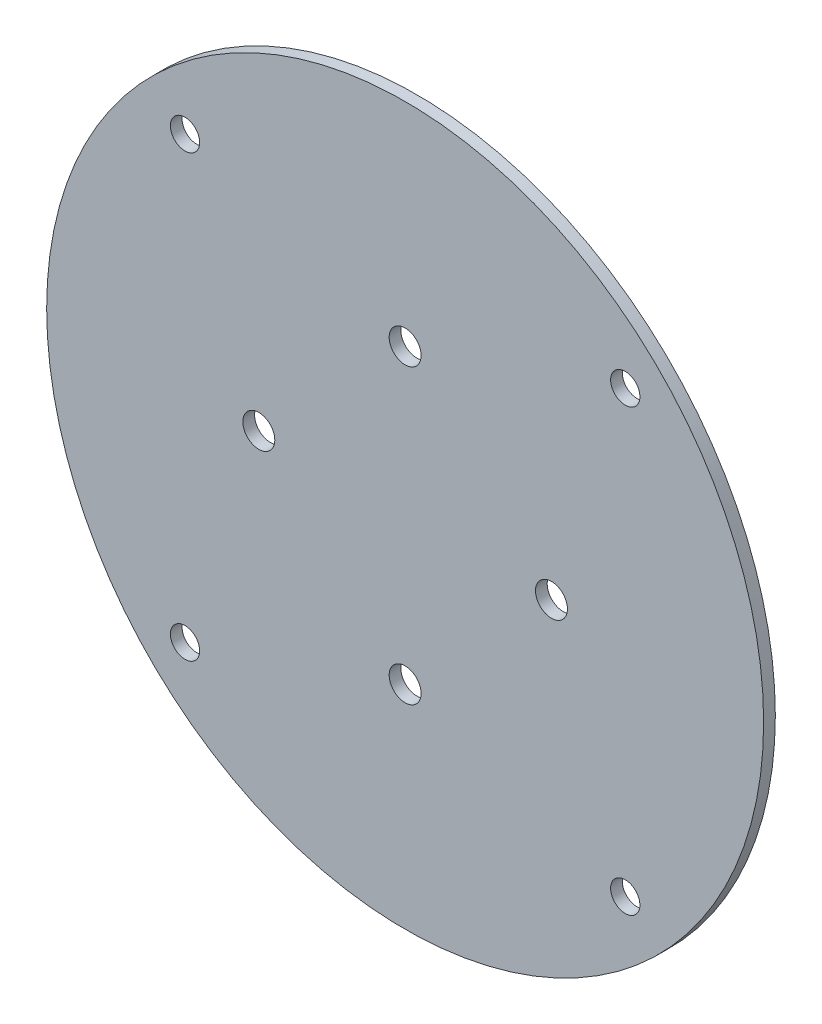
ISO-10303-21;
HEADER;
FILE_DESCRIPTION(('STEP AP214'),'2;1');
FILE_NAME('part.step','',(''),(''),'','','');
FILE_SCHEMA(('AUTOMOTIVE_DESIGN { 1 0 10303 214 1 1 1 1 }'));
ENDSEC;
DATA;
#1=APPLICATION_CONTEXT('core data for automotive mechanical design processes');
#2=APPLICATION_PROTOCOL_DEFINITION('international standard','automotive_design',2000,#1);
#3=PRODUCT_CONTEXT('',#1,'mechanical');
#4=PRODUCT('Part','Part','',(#3));
#5=PRODUCT_RELATED_PRODUCT_CATEGORY('part','',(#4));
#6=PRODUCT_DEFINITION_FORMATION('','',#4);
#7=PRODUCT_DEFINITION_CONTEXT('part definition',#1,'design');
#8=PRODUCT_DEFINITION('design','',#6,#7);
#9=PRODUCT_DEFINITION_SHAPE('','',#8);
#10=(LENGTH_UNIT() NAMED_UNIT(*) SI_UNIT(.MILLI.,.METRE.));
#11=(NAMED_UNIT(*) PLANE_ANGLE_UNIT() SI_UNIT($,.RADIAN.));
#12=(NAMED_UNIT(*) SI_UNIT($,.STERADIAN.) SOLID_ANGLE_UNIT());
#13=UNCERTAINTY_MEASURE_WITH_UNIT(LENGTH_MEASURE(1.E-05),#10,'distance_accuracy_value','');
#14=(GEOMETRIC_REPRESENTATION_CONTEXT(3) GLOBAL_UNCERTAINTY_ASSIGNED_CONTEXT((#13)) GLOBAL_UNIT_ASSIGNED_CONTEXT((#10,
#11,#12)) REPRESENTATION_CONTEXT('',''));
#15=CARTESIAN_POINT('',(0.,0.,0.));
#16=DIRECTION('',(0.,0.,1.));
#17=DIRECTION('',(1.,0.,0.));
#18=AXIS2_PLACEMENT_3D('',#15,#16,#17);
#19=CARTESIAN_POINT('',(0.,0.,1.6));
#20=DIRECTION('',(0.,0.,-1.));
#21=DIRECTION('',(-1.,0.,0.));
#22=AXIS2_PLACEMENT_3D('',#19,#20,#21);
#23=CYLINDRICAL_SURFACE('',#22,49.);
#24=CARTESIAN_POINT('',(0.,0.,1.6));
#25=DIRECTION('',(0.,0.,1.));
#26=DIRECTION('',(1.,0.,0.));
#27=AXIS2_PLACEMENT_3D('',#24,#25,#26);
#28=CIRCLE('',#27,49.);
#29=CARTESIAN_POINT('',(49.,0.,1.6));
#30=VERTEX_POINT('',#29);
#31=EDGE_CURVE('E10',#30,#30,#28,.T.);
#32=ORIENTED_EDGE('',*,*,#31,.F.);
#33=EDGE_LOOP('',(#32));
#34=FACE_BOUND('',#33,.T.);
#35=CARTESIAN_POINT('',(0.,0.,0.));
#36=DIRECTION('',(0.,0.,1.));
#37=DIRECTION('',(1.,0.,0.));
#38=AXIS2_PLACEMENT_3D('',#35,#36,#37);
#39=CIRCLE('',#38,49.);
#40=CARTESIAN_POINT('',(49.,0.,0.));
#41=VERTEX_POINT('',#40);
#42=EDGE_CURVE('E35',#41,#41,#39,.T.);
#43=ORIENTED_EDGE('',*,*,#42,.T.);
#44=EDGE_LOOP('',(#43));
#45=FACE_BOUND('',#44,.T.);
#46=ADVANCED_FACE('F32',(#34,#45),#23,.T.);
#47=CARTESIAN_POINT('',(0.,0.,1.6));
#48=DIRECTION('',(0.,0.,1.));
#49=DIRECTION('',(1.,0.,0.));
#50=AXIS2_PLACEMENT_3D('',#47,#48,#49);
#51=PLANE('',#50);
#52=CARTESIAN_POINT('',(20.,2.10300023761286E-13,1.6));
#53=DIRECTION('',(0.,0.,1.));
#54=DIRECTION('',(1.,0.,0.));
#55=AXIS2_PLACEMENT_3D('',#52,#53,#54);
#56=CIRCLE('',#55,2.183129746);
#57=CARTESIAN_POINT('',(22.183129746,2.10300023761286E-13,1.6));
#58=VERTEX_POINT('',#57);
#59=EDGE_CURVE('E71',#58,#58,#56,.T.);
#60=ORIENTED_EDGE('',*,*,#59,.F.);
#61=EDGE_LOOP('',(#60));
#62=FACE_BOUND('',#61,.T.);
#63=CARTESIAN_POINT('',(0.,-20.,1.6));
#64=DIRECTION('',(0.,0.,1.));
#65=DIRECTION('',(1.,0.,0.));
#66=AXIS2_PLACEMENT_3D('',#63,#64,#65);
#67=CIRCLE('',#66,2.183129746);
#68=CARTESIAN_POINT('',(2.183129746,-20.,1.6));
#69=VERTEX_POINT('',#68);
#70=EDGE_CURVE('E83',#69,#69,#67,.T.);
#71=ORIENTED_EDGE('',*,*,#70,.F.);
#72=EDGE_LOOP('',(#71));
#73=FACE_BOUND('',#72,.T.);
#74=CARTESIAN_POINT('',(-20.,0.,1.6));
#75=DIRECTION('',(0.,0.,1.));
#76=DIRECTION('',(1.,0.,0.));
#77=AXIS2_PLACEMENT_3D('',#74,#75,#76);
#78=CIRCLE('',#77,2.183129746);
#79=CARTESIAN_POINT('',(-17.816870254,0.,1.6));
#80=VERTEX_POINT('',#79);
#81=EDGE_CURVE('E77',#80,#80,#78,.T.);
#82=ORIENTED_EDGE('',*,*,#81,.F.);
#83=EDGE_LOOP('',(#82));
#84=FACE_BOUND('',#83,.T.);
#85=CARTESIAN_POINT('',(0.,20.,1.6));
#86=DIRECTION('',(0.,0.,1.));
#87=DIRECTION('',(1.,0.,0.));
#88=AXIS2_PLACEMENT_3D('',#85,#86,#87);
#89=CIRCLE('',#88,2.183129746);
#90=CARTESIAN_POINT('',(2.183129746,20.,1.6));
#91=VERTEX_POINT('',#90);
#92=EDGE_CURVE('E67',#91,#91,#89,.T.);
#93=ORIENTED_EDGE('',*,*,#92,.F.);
#94=EDGE_LOOP('',(#93));
#95=FACE_BOUND('',#94,.T.);
#96=CARTESIAN_POINT('',(-30.0873935392364,30.0873935397388,1.6));
#97=DIRECTION('',(0.,0.,-1.));
#98=DIRECTION('',(-1.,0.,0.));
#99=AXIS2_PLACEMENT_3D('',#96,#97,#98);
#100=CIRCLE('',#99,2.);
#101=CARTESIAN_POINT('',(-32.0873935392364,30.0873935397388,1.6));
#102=VERTEX_POINT('',#101);
#103=EDGE_CURVE('E61',#102,#102,#100,.T.);
#104=ORIENTED_EDGE('',*,*,#103,.T.);
#105=EDGE_LOOP('',(#104));
#106=FACE_BOUND('',#105,.T.);
#107=CARTESIAN_POINT('',(30.0873935392464,30.0873935397288,1.6));
#108=DIRECTION('',(0.,0.,-1.));
#109=DIRECTION('',(-1.,0.,0.));
#110=AXIS2_PLACEMENT_3D('',#107,#108,#109);
#111=CIRCLE('',#110,2.);
#112=CARTESIAN_POINT('',(28.0873935392464,30.0873935397288,1.6));
#113=VERTEX_POINT('',#112);
#114=EDGE_CURVE('E55',#113,#113,#111,.T.);
#115=ORIENTED_EDGE('',*,*,#114,.T.);
#116=EDGE_LOOP('',(#115));
#117=FACE_BOUND('',#116,.T.);
#118=CARTESIAN_POINT('',(30.0873935392444,-30.0873935387419,1.6));
#119=DIRECTION('',(0.,0.,-1.));
#120=DIRECTION('',(-1.,0.,0.));
#121=AXIS2_PLACEMENT_3D('',#118,#119,#120);
#122=CIRCLE('',#121,2.);
#123=CARTESIAN_POINT('',(28.0873935392444,-30.0873935387419,1.6));
#124=VERTEX_POINT('',#123);
#125=EDGE_CURVE('E49',#124,#124,#122,.T.);
#126=ORIENTED_EDGE('',*,*,#125,.T.);
#127=EDGE_LOOP('',(#126));
#128=FACE_BOUND('',#127,.T.);
#129=CARTESIAN_POINT('',(-30.0873935397288,-30.0873935392464,1.6));
#130=DIRECTION('',(0.,0.,-1.));
#131=DIRECTION('',(-1.,0.,0.));
#132=AXIS2_PLACEMENT_3D('',#129,#130,#131);
#133=CIRCLE('',#132,2.);
#134=CARTESIAN_POINT('',(-32.0873935397288,-30.0873935392464,1.6));
#135=VERTEX_POINT('',#134);
#136=EDGE_CURVE('E42',#135,#135,#133,.T.);
#137=ORIENTED_EDGE('',*,*,#136,.T.);
#138=EDGE_LOOP('',(#137));
#139=FACE_BOUND('',#138,.T.);
#140=ORIENTED_EDGE('',*,*,#31,.T.);
#141=EDGE_LOOP('',(#140));
#142=FACE_BOUND('',#141,.T.);
#143=ADVANCED_FACE('F95',(#62,#73,#84,#95,#106,#117,#128,#139,#142),#51,.T.);
#144=CARTESIAN_POINT('',(0.,0.,0.));
#145=DIRECTION('',(0.,0.,1.));
#146=DIRECTION('',(1.,0.,0.));
#147=AXIS2_PLACEMENT_3D('',#144,#145,#146);
#148=PLANE('',#147);
#149=CARTESIAN_POINT('',(20.,2.10300023761286E-13,0.));
#150=DIRECTION('',(0.,0.,1.));
#151=DIRECTION('',(1.,0.,0.));
#152=AXIS2_PLACEMENT_3D('',#149,#150,#151);
#153=CIRCLE('',#152,2.183129746);
#154=CARTESIAN_POINT('',(22.183129746,2.10300023761286E-13,0.));
#155=VERTEX_POINT('',#154);
#156=EDGE_CURVE('E86',#155,#155,#153,.T.);
#157=ORIENTED_EDGE('',*,*,#156,.T.);
#158=EDGE_LOOP('',(#157));
#159=FACE_BOUND('',#158,.T.);
#160=CARTESIAN_POINT('',(0.,-20.,0.));
#161=DIRECTION('',(0.,0.,1.));
#162=DIRECTION('',(1.,0.,0.));
#163=AXIS2_PLACEMENT_3D('',#160,#161,#162);
#164=CIRCLE('',#163,2.183129746);
#165=CARTESIAN_POINT('',(2.183129746,-20.,0.));
#166=VERTEX_POINT('',#165);
#167=EDGE_CURVE('E80',#166,#166,#164,.T.);
#168=ORIENTED_EDGE('',*,*,#167,.T.);
#169=EDGE_LOOP('',(#168));
#170=FACE_BOUND('',#169,.T.);
#171=CARTESIAN_POINT('',(-20.,0.,0.));
#172=DIRECTION('',(0.,0.,1.));
#173=DIRECTION('',(1.,0.,0.));
#174=AXIS2_PLACEMENT_3D('',#171,#172,#173);
#175=CIRCLE('',#174,2.183129746);
#176=CARTESIAN_POINT('',(-17.816870254,0.,0.));
#177=VERTEX_POINT('',#176);
#178=EDGE_CURVE('E74',#177,#177,#175,.T.);
#179=ORIENTED_EDGE('',*,*,#178,.T.);
#180=EDGE_LOOP('',(#179));
#181=FACE_BOUND('',#180,.T.);
#182=CARTESIAN_POINT('',(0.,20.,0.));
#183=DIRECTION('',(0.,0.,1.));
#184=DIRECTION('',(1.,0.,0.));
#185=AXIS2_PLACEMENT_3D('',#182,#183,#184);
#186=CIRCLE('',#185,2.183129746);
#187=CARTESIAN_POINT('',(2.183129746,20.,0.));
#188=VERTEX_POINT('',#187);
#189=EDGE_CURVE('E68',#188,#188,#186,.T.);
#190=ORIENTED_EDGE('',*,*,#189,.T.);
#191=EDGE_LOOP('',(#190));
#192=FACE_BOUND('',#191,.T.);
#193=CARTESIAN_POINT('',(-30.0873935392364,30.0873935397388,0.));
#194=DIRECTION('',(0.,0.,-1.));
#195=DIRECTION('',(-1.,0.,0.));
#196=AXIS2_PLACEMENT_3D('',#193,#194,#195);
#197=CIRCLE('',#196,2.);
#198=CARTESIAN_POINT('',(-32.0873935392364,30.0873935397388,0.));
#199=VERTEX_POINT('',#198);
#200=EDGE_CURVE('E64',#199,#199,#197,.T.);
#201=ORIENTED_EDGE('',*,*,#200,.F.);
#202=EDGE_LOOP('',(#201));
#203=FACE_BOUND('',#202,.T.);
#204=CARTESIAN_POINT('',(30.0873935392464,30.0873935397288,0.));
#205=DIRECTION('',(0.,0.,-1.));
#206=DIRECTION('',(-1.,0.,0.));
#207=AXIS2_PLACEMENT_3D('',#204,#205,#206);
#208=CIRCLE('',#207,1.99999999999999);
#209=CARTESIAN_POINT('',(28.0873935392464,30.0873935397288,0.));
#210=VERTEX_POINT('',#209);
#211=EDGE_CURVE('E58',#210,#210,#208,.T.);
#212=ORIENTED_EDGE('',*,*,#211,.F.);
#213=EDGE_LOOP('',(#212));
#214=FACE_BOUND('',#213,.T.);
#215=CARTESIAN_POINT('',(30.0873935392444,-30.0873935387419,0.));
#216=DIRECTION('',(0.,0.,-1.));
#217=DIRECTION('',(-1.,0.,0.));
#218=AXIS2_PLACEMENT_3D('',#215,#216,#217);
#219=CIRCLE('',#218,2.);
#220=CARTESIAN_POINT('',(28.0873935392444,-30.0873935387419,0.));
#221=VERTEX_POINT('',#220);
#222=EDGE_CURVE('E52',#221,#221,#219,.T.);
#223=ORIENTED_EDGE('',*,*,#222,.F.);
#224=EDGE_LOOP('',(#223));
#225=FACE_BOUND('',#224,.T.);
#226=CARTESIAN_POINT('',(-30.0873935397288,-30.0873935392464,0.));
#227=DIRECTION('',(0.,0.,-1.));
#228=DIRECTION('',(-1.,0.,0.));
#229=AXIS2_PLACEMENT_3D('',#226,#227,#228);
#230=CIRCLE('',#229,2.);
#231=CARTESIAN_POINT('',(-32.0873935397288,-30.0873935392464,0.));
#232=VERTEX_POINT('',#231);
#233=EDGE_CURVE('E46',#232,#232,#230,.T.);
#234=ORIENTED_EDGE('',*,*,#233,.F.);
#235=EDGE_LOOP('',(#234));
#236=FACE_BOUND('',#235,.T.);
#237=ORIENTED_EDGE('',*,*,#42,.F.);
#238=EDGE_LOOP('',(#237));
#239=FACE_BOUND('',#238,.T.);
#240=ADVANCED_FACE('F98',(#159,#170,#181,#192,#203,#214,#225,#236,#239),#148,.F.);
#241=CARTESIAN_POINT('',(-30.0873935397288,-30.0873935392464,0.));
#242=DIRECTION('',(0.,0.,-1.));
#243=DIRECTION('',(-1.,0.,0.));
#244=AXIS2_PLACEMENT_3D('',#241,#242,#243);
#245=CYLINDRICAL_SURFACE('',#244,2.);
#246=ORIENTED_EDGE('',*,*,#136,.F.);
#247=EDGE_LOOP('',(#246));
#248=FACE_BOUND('',#247,.T.);
#249=ORIENTED_EDGE('',*,*,#233,.T.);
#250=EDGE_LOOP('',(#249));
#251=FACE_BOUND('',#250,.T.);
#252=ADVANCED_FACE('F114',(#248,#251),#245,.F.);
#253=CARTESIAN_POINT('',(30.0873935392444,-30.0873935387419,0.));
#254=DIRECTION('',(0.,0.,-1.));
#255=DIRECTION('',(-1.,0.,0.));
#256=AXIS2_PLACEMENT_3D('',#253,#254,#255);
#257=CYLINDRICAL_SURFACE('',#256,2.);
#258=ORIENTED_EDGE('',*,*,#125,.F.);
#259=EDGE_LOOP('',(#258));
#260=FACE_BOUND('',#259,.T.);
#261=ORIENTED_EDGE('',*,*,#222,.T.);
#262=EDGE_LOOP('',(#261));
#263=FACE_BOUND('',#262,.T.);
#264=ADVANCED_FACE('F117',(#260,#263),#257,.F.);
#265=CARTESIAN_POINT('',(30.0873935392464,30.0873935397288,0.));
#266=DIRECTION('',(0.,0.,-1.));
#267=DIRECTION('',(-1.,0.,0.));
#268=AXIS2_PLACEMENT_3D('',#265,#266,#267);
#269=CYLINDRICAL_SURFACE('',#268,2.);
#270=ORIENTED_EDGE('',*,*,#114,.F.);
#271=EDGE_LOOP('',(#270));
#272=FACE_BOUND('',#271,.T.);
#273=ORIENTED_EDGE('',*,*,#211,.T.);
#274=EDGE_LOOP('',(#273));
#275=FACE_BOUND('',#274,.T.);
#276=ADVANCED_FACE('F150',(#272,#275),#269,.F.);
#277=CARTESIAN_POINT('',(-30.0873935392364,30.0873935397388,0.));
#278=DIRECTION('',(0.,0.,-1.));
#279=DIRECTION('',(-1.,0.,0.));
#280=AXIS2_PLACEMENT_3D('',#277,#278,#279);
#281=CYLINDRICAL_SURFACE('',#280,2.);
#282=ORIENTED_EDGE('',*,*,#103,.F.);
#283=EDGE_LOOP('',(#282));
#284=FACE_BOUND('',#283,.T.);
#285=ORIENTED_EDGE('',*,*,#200,.T.);
#286=EDGE_LOOP('',(#285));
#287=FACE_BOUND('',#286,.T.);
#288=ADVANCED_FACE('F158',(#284,#287),#281,.F.);
#289=CARTESIAN_POINT('',(0.,20.,1.6));
#290=DIRECTION('',(0.,0.,-1.));
#291=DIRECTION('',(-1.,0.,0.));
#292=AXIS2_PLACEMENT_3D('',#289,#290,#291);
#293=CYLINDRICAL_SURFACE('',#292,2.183129746);
#294=ORIENTED_EDGE('',*,*,#92,.T.);
#295=EDGE_LOOP('',(#294));
#296=FACE_BOUND('',#295,.T.);
#297=ORIENTED_EDGE('',*,*,#189,.F.);
#298=EDGE_LOOP('',(#297));
#299=FACE_BOUND('',#298,.T.);
#300=ADVANCED_FACE('F165',(#296,#299),#293,.F.);
#301=CARTESIAN_POINT('',(-20.,0.,1.6));
#302=DIRECTION('',(0.,0.,-1.));
#303=DIRECTION('',(-1.,0.,0.));
#304=AXIS2_PLACEMENT_3D('',#301,#302,#303);
#305=CYLINDRICAL_SURFACE('',#304,2.183129746);
#306=ORIENTED_EDGE('',*,*,#81,.T.);
#307=EDGE_LOOP('',(#306));
#308=FACE_BOUND('',#307,.T.);
#309=ORIENTED_EDGE('',*,*,#178,.F.);
#310=EDGE_LOOP('',(#309));
#311=FACE_BOUND('',#310,.T.);
#312=ADVANCED_FACE('F172',(#308,#311),#305,.F.);
#313=CARTESIAN_POINT('',(0.,-20.,1.6));
#314=DIRECTION('',(0.,0.,-1.));
#315=DIRECTION('',(-1.,0.,0.));
#316=AXIS2_PLACEMENT_3D('',#313,#314,#315);
#317=CYLINDRICAL_SURFACE('',#316,2.183129746);
#318=ORIENTED_EDGE('',*,*,#70,.T.);
#319=EDGE_LOOP('',(#318));
#320=FACE_BOUND('',#319,.T.);
#321=ORIENTED_EDGE('',*,*,#167,.F.);
#322=EDGE_LOOP('',(#321));
#323=FACE_BOUND('',#322,.T.);
#324=ADVANCED_FACE('F180',(#320,#323),#317,.F.);
#325=CARTESIAN_POINT('',(20.,2.10300023761286E-13,1.6));
#326=DIRECTION('',(0.,0.,-1.));
#327=DIRECTION('',(-1.,0.,0.));
#328=AXIS2_PLACEMENT_3D('',#325,#326,#327);
#329=CYLINDRICAL_SURFACE('',#328,2.183129746);
#330=ORIENTED_EDGE('',*,*,#59,.T.);
#331=EDGE_LOOP('',(#330));
#332=FACE_BOUND('',#331,.T.);
#333=ORIENTED_EDGE('',*,*,#156,.F.);
#334=EDGE_LOOP('',(#333));
#335=FACE_BOUND('',#334,.T.);
#336=ADVANCED_FACE('F92',(#332,#335),#329,.F.);
#337=CLOSED_SHELL('',(#46,#143,#240,#252,#264,#276,#288,#300,#312,#324,#336));
#338=MANIFOLD_SOLID_BREP('B2',#337);
#339=ADVANCED_BREP_SHAPE_REPRESENTATION('',(#18,#338),#14);
#340=SHAPE_DEFINITION_REPRESENTATION(#9,#339);
ENDSEC;
END-ISO-10303-21;
